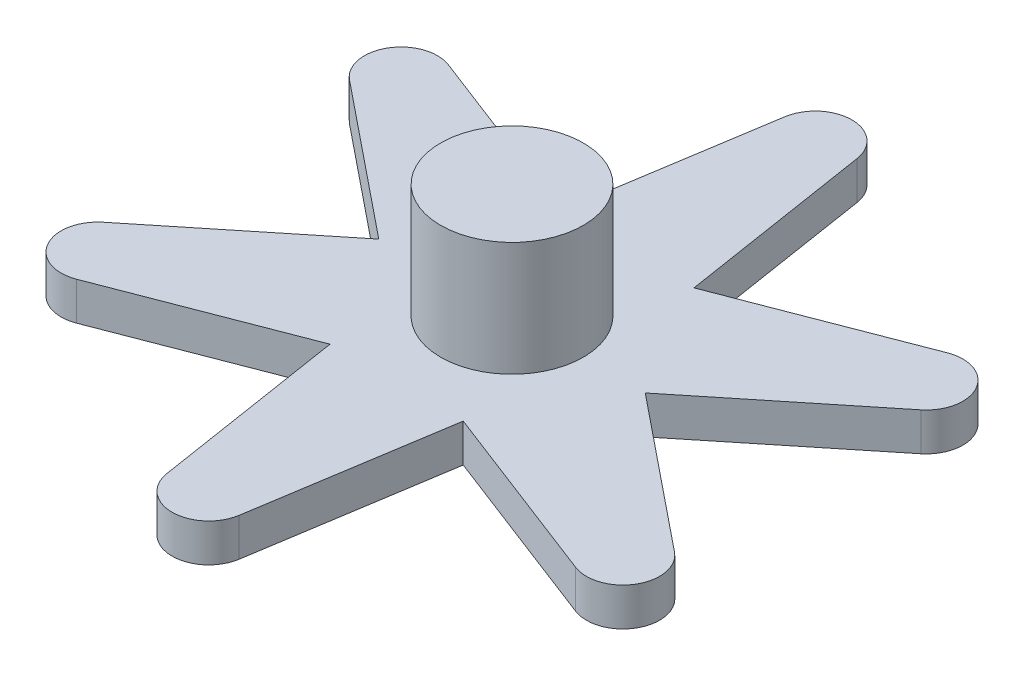
ISO-10303-21;
HEADER;
FILE_DESCRIPTION(('STEP AP214'),'2;1');
FILE_NAME('part.step','',(''),(''),'','','');
FILE_SCHEMA(('AUTOMOTIVE_DESIGN { 1 0 10303 214 1 1 1 1 }'));
ENDSEC;
DATA;
#1=APPLICATION_CONTEXT('core data for automotive mechanical design processes');
#2=APPLICATION_PROTOCOL_DEFINITION('international standard','automotive_design',2000,#1);
#3=PRODUCT_CONTEXT('',#1,'mechanical');
#4=PRODUCT('Part','Part','',(#3));
#5=PRODUCT_RELATED_PRODUCT_CATEGORY('part','',(#4));
#6=PRODUCT_DEFINITION_FORMATION('','',#4);
#7=PRODUCT_DEFINITION_CONTEXT('part definition',#1,'design');
#8=PRODUCT_DEFINITION('design','',#6,#7);
#9=PRODUCT_DEFINITION_SHAPE('','',#8);
#10=(LENGTH_UNIT() NAMED_UNIT(*) SI_UNIT(.MILLI.,.METRE.));
#11=(NAMED_UNIT(*) PLANE_ANGLE_UNIT() SI_UNIT($,.RADIAN.));
#12=(NAMED_UNIT(*) SI_UNIT($,.STERADIAN.) SOLID_ANGLE_UNIT());
#13=UNCERTAINTY_MEASURE_WITH_UNIT(LENGTH_MEASURE(1.E-05),#10,'distance_accuracy_value','');
#14=(GEOMETRIC_REPRESENTATION_CONTEXT(3) GLOBAL_UNCERTAINTY_ASSIGNED_CONTEXT((#13)) GLOBAL_UNIT_ASSIGNED_CONTEXT((#10,
#11,#12)) REPRESENTATION_CONTEXT('',''));
#15=CARTESIAN_POINT('',(0.,0.,0.));
#16=DIRECTION('',(0.,0.,1.));
#17=DIRECTION('',(1.,0.,0.));
#18=AXIS2_PLACEMENT_3D('',#15,#16,#17);
#19=CARTESIAN_POINT('',(0.,2.,0.));
#20=DIRECTION('',(0.,1.,0.));
#21=DIRECTION('',(0.,0.,1.));
#22=AXIS2_PLACEMENT_3D('',#19,#20,#21);
#23=PLANE('',#22);
#24=DIRECTION('',(-0.155411112427727,0.,0.987849880363396));
#25=VECTOR('',#24,1.);
#26=CARTESIAN_POINT('',(-3.5,2.,-6.06217782649107));
#27=LINE('',#26,#25);
#28=CARTESIAN_POINT('',(-1.9,2.,-16.232363110484));
#29=VERTEX_POINT('',#28);
#30=CARTESIAN_POINT('',(-3.5,2.,-6.06217782649107));
#31=VERTEX_POINT('',#30);
#32=EDGE_CURVE('E281',#29,#31,#27,.T.);
#33=ORIENTED_EDGE('',*,*,#32,.T.);
#34=DIRECTION('',(-0.933208647733979,0.,-0.359334968788898));
#35=VECTOR('',#34,1.);
#36=CARTESIAN_POINT('',(-13.1076388171324,2.,-9.76162982243258));
#37=LINE('',#36,#35);
#38=CARTESIAN_POINT('',(-13.1076388171324,2.,-9.76162982243258));
#39=VERTEX_POINT('',#38);
#40=EDGE_CURVE('E164',#31,#39,#37,.T.);
#41=ORIENTED_EDGE('',*,*,#40,.T.);
#42=CARTESIAN_POINT('',(-13.7987726161746,2.,-7.96672508443505));
#43=DIRECTION('',(0.,1.,0.));
#44=DIRECTION('',(-0.866025403784433,0.,-0.50000000000001));
#45=AXIS2_PLACEMENT_3D('',#42,#43,#44);
#46=CIRCLE('',#45,1.92336916546576);
#47=CARTESIAN_POINT('',(-15.0076388171324,2.,-6.47073328805174));
#48=VERTEX_POINT('',#47);
#49=EDGE_CURVE('E175',#39,#48,#46,.T.);
#50=ORIENTED_EDGE('',*,*,#49,.T.);
#51=DIRECTION('',(0.777797535306249,0.,0.628514911574518));
#52=VECTOR('',#51,1.);
#53=CARTESIAN_POINT('',(-7.,2.,0.));
#54=LINE('',#53,#52);
#55=CARTESIAN_POINT('',(-7.,2.,0.));
#56=VERTEX_POINT('',#55);
#57=EDGE_CURVE('E179',#48,#56,#54,.T.);
#58=ORIENTED_EDGE('',*,*,#57,.T.);
#59=DIRECTION('',(-0.777797535306262,0.,0.628514911574502));
#60=VECTOR('',#59,1.);
#61=CARTESIAN_POINT('',(-15.0076388171326,2.,6.47073328805142));
#62=LINE('',#61,#60);
#63=CARTESIAN_POINT('',(-15.0076388171326,2.,6.47073328805142));
#64=VERTEX_POINT('',#63);
#65=EDGE_CURVE('E199',#56,#64,#62,.T.);
#66=ORIENTED_EDGE('',*,*,#65,.T.);
#67=CARTESIAN_POINT('',(-13.7987726161747,2.,7.96672508443476));
#68=DIRECTION('',(0.,1.,0.));
#69=DIRECTION('',(-0.866025403784443,0.,0.499999999999992));
#70=AXIS2_PLACEMENT_3D('',#67,#68,#69);
#71=CIRCLE('',#70,1.92336916546576);
#72=CARTESIAN_POINT('',(-13.1076388171326,2.,9.7616298224323));
#73=VERTEX_POINT('',#72);
#74=EDGE_CURVE('E197',#64,#73,#71,.T.);
#75=ORIENTED_EDGE('',*,*,#74,.T.);
#76=DIRECTION('',(0.933208647733986,0.,-0.359334968788879));
#77=VECTOR('',#76,1.);
#78=CARTESIAN_POINT('',(-3.50000000000006,2.,6.06217782649104));
#79=LINE('',#78,#77);
#80=CARTESIAN_POINT('',(-3.50000000000006,2.,6.06217782649104));
#81=VERTEX_POINT('',#80);
#82=EDGE_CURVE('E203',#73,#81,#79,.T.);
#83=ORIENTED_EDGE('',*,*,#82,.T.);
#84=DIRECTION('',(0.155411112427727,0.,0.987849880363396));
#85=VECTOR('',#84,1.);
#86=CARTESIAN_POINT('',(-1.9,2.,16.232363110484));
#87=LINE('',#86,#85);
#88=CARTESIAN_POINT('',(-1.9,2.,16.232363110484));
#89=VERTEX_POINT('',#88);
#90=EDGE_CURVE('E220',#81,#89,#87,.T.);
#91=ORIENTED_EDGE('',*,*,#90,.T.);
#92=CARTESIAN_POINT('',(0.,2.,15.9334501688698));
#93=DIRECTION('',(0.,1.,0.));
#94=DIRECTION('',(0.,0.,1.));
#95=AXIS2_PLACEMENT_3D('',#92,#93,#94);
#96=CIRCLE('',#95,1.92336916546576);
#97=CARTESIAN_POINT('',(1.9,2.,16.232363110484));
#98=VERTEX_POINT('',#97);
#99=EDGE_CURVE('E218',#89,#98,#96,.T.);
#100=ORIENTED_EDGE('',*,*,#99,.T.);
#101=DIRECTION('',(0.155411112427727,0.,-0.987849880363396));
#102=VECTOR('',#101,1.);
#103=CARTESIAN_POINT('',(3.5,2.,6.06217782649107));
#104=LINE('',#103,#102);
#105=CARTESIAN_POINT('',(3.5,2.,6.06217782649107));
#106=VERTEX_POINT('',#105);
#107=EDGE_CURVE('E224',#98,#106,#104,.T.);
#108=ORIENTED_EDGE('',*,*,#107,.T.);
#109=DIRECTION('',(0.933208647733982,0.,0.359334968788892));
#110=VECTOR('',#109,1.);
#111=CARTESIAN_POINT('',(13.1076388171325,2.,9.76162982243249));
#112=LINE('',#111,#110);
#113=CARTESIAN_POINT('',(13.1076388171325,2.,9.76162982243249));
#114=VERTEX_POINT('',#113);
#115=EDGE_CURVE('E242',#106,#114,#112,.T.);
#116=ORIENTED_EDGE('',*,*,#115,.T.);
#117=CARTESIAN_POINT('',(13.7987726161746,2.,7.96672508443495));
#118=DIRECTION('',(0.,1.,0.));
#119=DIRECTION('',(0.866025403784436,0.,0.500000000000004));
#120=AXIS2_PLACEMENT_3D('',#117,#118,#119);
#121=CIRCLE('',#120,1.92336916546576);
#122=CARTESIAN_POINT('',(15.0076388171325,2.,6.47073328805163));
#123=VERTEX_POINT('',#122);
#124=EDGE_CURVE('E240',#114,#123,#121,.T.);
#125=ORIENTED_EDGE('',*,*,#124,.T.);
#126=DIRECTION('',(-0.777797535306254,0.,-0.628514911574513));
#127=VECTOR('',#126,1.);
#128=CARTESIAN_POINT('',(7.,2.,0.));
#129=LINE('',#128,#127);
#130=CARTESIAN_POINT('',(7.,2.,0.));
#131=VERTEX_POINT('',#130);
#132=EDGE_CURVE('E246',#123,#131,#129,.T.);
#133=ORIENTED_EDGE('',*,*,#132,.T.);
#134=DIRECTION('',(0.777797535306258,0.,-0.628514911574507));
#135=VECTOR('',#134,1.);
#136=CARTESIAN_POINT('',(15.0076388171325,2.,-6.47073328805152));
#137=LINE('',#136,#135);
#138=CARTESIAN_POINT('',(15.0076388171325,2.,-6.47073328805152));
#139=VERTEX_POINT('',#138);
#140=EDGE_CURVE('E264',#131,#139,#137,.T.);
#141=ORIENTED_EDGE('',*,*,#140,.T.);
#142=CARTESIAN_POINT('',(13.7987726161747,2.,-7.96672508443485));
#143=DIRECTION('',(0.,1.,0.));
#144=DIRECTION('',(0.86602540378444,0.,-0.499999999999998));
#145=AXIS2_PLACEMENT_3D('',#142,#143,#144);
#146=CIRCLE('',#145,1.92336916546576);
#147=CARTESIAN_POINT('',(13.1076388171325,2.,-9.7616298224324));
#148=VERTEX_POINT('',#147);
#149=EDGE_CURVE('E233',#139,#148,#146,.T.);
#150=ORIENTED_EDGE('',*,*,#149,.T.);
#151=DIRECTION('',(-0.933208647733984,0.,0.359334968788885));
#152=VECTOR('',#151,1.);
#153=CARTESIAN_POINT('',(3.50000000000001,2.,-6.06217782649106));
#154=LINE('',#153,#152);
#155=CARTESIAN_POINT('',(3.50000000000001,2.,-6.06217782649106));
#156=VERTEX_POINT('',#155);
#157=EDGE_CURVE('E261',#148,#156,#154,.T.);
#158=ORIENTED_EDGE('',*,*,#157,.T.);
#159=DIRECTION('',(-0.155411112427727,0.,-0.987849880363396));
#160=VECTOR('',#159,1.);
#161=CARTESIAN_POINT('',(1.9,2.,-16.232363110484));
#162=LINE('',#161,#160);
#163=CARTESIAN_POINT('',(1.9,2.,-16.232363110484));
#164=VERTEX_POINT('',#163);
#165=EDGE_CURVE('E284',#156,#164,#162,.T.);
#166=ORIENTED_EDGE('',*,*,#165,.T.);
#167=CARTESIAN_POINT('',(0.,2.,-15.9334501688698));
#168=DIRECTION('',(0.,1.,0.));
#169=DIRECTION('',(0.,0.,-1.));
#170=AXIS2_PLACEMENT_3D('',#167,#168,#169);
#171=CIRCLE('',#170,1.92336916546576);
#172=EDGE_CURVE('E274',#164,#29,#171,.T.);
#173=ORIENTED_EDGE('',*,*,#172,.T.);
#174=EDGE_LOOP('',(#33,#41,#50,#58,#66,#75,#83,#91,#100,#108,#116,#125,#133,#141,#150,#158,#166,#173));
#175=FACE_BOUND('',#174,.T.);
#176=CARTESIAN_POINT('',(0.,2.,0.));
#177=DIRECTION('',(0.,1.,0.));
#178=DIRECTION('',(0.,0.,1.));
#179=AXIS2_PLACEMENT_3D('',#176,#177,#178);
#180=CIRCLE('',#179,3.75);
#181=CARTESIAN_POINT('',(0.,2.,3.75));
#182=VERTEX_POINT('',#181);
#183=EDGE_CURVE('E363',#182,#182,#180,.T.);
#184=ORIENTED_EDGE('',*,*,#183,.F.);
#185=EDGE_LOOP('',(#184));
#186=FACE_BOUND('',#185,.T.);
#187=ADVANCED_FACE('F33',(#175,#186),#23,.T.);
#188=CARTESIAN_POINT('',(0.,0.,0.));
#189=DIRECTION('',(0.,1.,0.));
#190=DIRECTION('',(0.,0.,1.));
#191=AXIS2_PLACEMENT_3D('',#188,#189,#190);
#192=PLANE('',#191);
#193=DIRECTION('',(0.777797535306262,0.,-0.628514911574502));
#194=VECTOR('',#193,1.);
#195=CARTESIAN_POINT('',(-15.0076388171326,0.,6.47073328805142));
#196=LINE('',#195,#194);
#197=CARTESIAN_POINT('',(-15.0076388171326,0.,6.47073328805142));
#198=VERTEX_POINT('',#197);
#199=CARTESIAN_POINT('',(-7.,0.,0.));
#200=VERTEX_POINT('',#199);
#201=EDGE_CURVE('E48',#198,#200,#196,.T.);
#202=ORIENTED_EDGE('',*,*,#201,.T.);
#203=DIRECTION('',(-0.777797535306249,0.,-0.628514911574518));
#204=VECTOR('',#203,1.);
#205=CARTESIAN_POINT('',(-7.,0.,0.));
#206=LINE('',#205,#204);
#207=CARTESIAN_POINT('',(-15.0076388171324,0.,-6.47073328805173));
#208=VERTEX_POINT('',#207);
#209=EDGE_CURVE('E160',#200,#208,#206,.T.);
#210=ORIENTED_EDGE('',*,*,#209,.T.);
#211=CARTESIAN_POINT('',(-13.7987726161746,0.,-7.96672508443505));
#212=DIRECTION('',(0.,1.,0.));
#213=DIRECTION('',(0.,0.,1.));
#214=AXIS2_PLACEMENT_3D('',#211,#212,#213);
#215=CIRCLE('',#214,1.92336916546576);
#216=CARTESIAN_POINT('',(-13.1076388171324,0.,-9.76162982243258));
#217=VERTEX_POINT('',#216);
#218=EDGE_CURVE('E155',#208,#217,#215,.F.);
#219=ORIENTED_EDGE('',*,*,#218,.T.);
#220=DIRECTION('',(0.933208647733979,0.,0.359334968788898));
#221=VECTOR('',#220,1.);
#222=CARTESIAN_POINT('',(-13.1076388171324,0.,-9.76162982243258));
#223=LINE('',#222,#221);
#224=CARTESIAN_POINT('',(-3.5,0.,-6.06217782649107));
#225=VERTEX_POINT('',#224);
#226=EDGE_CURVE('E157',#217,#225,#223,.T.);
#227=ORIENTED_EDGE('',*,*,#226,.T.);
#228=DIRECTION('',(0.155411112427727,0.,-0.987849880363396));
#229=VECTOR('',#228,1.);
#230=CARTESIAN_POINT('',(-3.5,0.,-6.06217782649107));
#231=LINE('',#230,#229);
#232=CARTESIAN_POINT('',(-1.9,0.,-16.232363110484));
#233=VERTEX_POINT('',#232);
#234=EDGE_CURVE('E11',#225,#233,#231,.T.);
#235=ORIENTED_EDGE('',*,*,#234,.T.);
#236=CARTESIAN_POINT('',(0.,0.,-15.9334501688698));
#237=DIRECTION('',(0.,1.,0.));
#238=DIRECTION('',(0.,0.,1.));
#239=AXIS2_PLACEMENT_3D('',#236,#237,#238);
#240=CIRCLE('',#239,1.92336916546576);
#241=CARTESIAN_POINT('',(1.9,0.,-16.232363110484));
#242=VERTEX_POINT('',#241);
#243=EDGE_CURVE('E41',#233,#242,#240,.F.);
#244=ORIENTED_EDGE('',*,*,#243,.T.);
#245=DIRECTION('',(0.155411112427727,0.,0.987849880363396));
#246=VECTOR('',#245,1.);
#247=CARTESIAN_POINT('',(1.9,0.,-16.232363110484));
#248=LINE('',#247,#246);
#249=CARTESIAN_POINT('',(3.5,0.,-6.06217782649107));
#250=VERTEX_POINT('',#249);
#251=EDGE_CURVE('E275',#242,#250,#248,.T.);
#252=ORIENTED_EDGE('',*,*,#251,.T.);
#253=DIRECTION('',(0.933208647733984,0.,-0.359334968788885));
#254=VECTOR('',#253,1.);
#255=CARTESIAN_POINT('',(3.50000000000001,0.,-6.06217782649106));
#256=LINE('',#255,#254);
#257=CARTESIAN_POINT('',(13.1076388171325,0.,-9.7616298224324));
#258=VERTEX_POINT('',#257);
#259=EDGE_CURVE('E258',#250,#258,#256,.T.);
#260=ORIENTED_EDGE('',*,*,#259,.T.);
#261=CARTESIAN_POINT('',(13.7987726161747,0.,-7.96672508443485));
#262=DIRECTION('',(0.,1.,0.));
#263=DIRECTION('',(0.,0.,1.));
#264=AXIS2_PLACEMENT_3D('',#261,#262,#263);
#265=CIRCLE('',#264,1.92336916546576);
#266=CARTESIAN_POINT('',(15.0076388171325,0.,-6.47073328805152));
#267=VERTEX_POINT('',#266);
#268=EDGE_CURVE('E255',#258,#267,#265,.F.);
#269=ORIENTED_EDGE('',*,*,#268,.T.);
#270=DIRECTION('',(-0.777797535306258,0.,0.628514911574507));
#271=VECTOR('',#270,1.);
#272=CARTESIAN_POINT('',(15.0076388171325,0.,-6.47073328805152));
#273=LINE('',#272,#271);
#274=CARTESIAN_POINT('',(7.,0.,0.));
#275=VERTEX_POINT('',#274);
#276=EDGE_CURVE('E253',#267,#275,#273,.T.);
#277=ORIENTED_EDGE('',*,*,#276,.T.);
#278=DIRECTION('',(0.777797535306254,0.,0.628514911574513));
#279=VECTOR('',#278,1.);
#280=CARTESIAN_POINT('',(7.,0.,0.));
#281=LINE('',#280,#279);
#282=CARTESIAN_POINT('',(15.0076388171325,0.,6.47073328805163));
#283=VERTEX_POINT('',#282);
#284=EDGE_CURVE('E231',#275,#283,#281,.T.);
#285=ORIENTED_EDGE('',*,*,#284,.T.);
#286=CARTESIAN_POINT('',(13.7987726161746,0.,7.96672508443495));
#287=DIRECTION('',(0.,1.,0.));
#288=DIRECTION('',(0.,0.,1.));
#289=AXIS2_PLACEMENT_3D('',#286,#287,#288);
#290=CIRCLE('',#289,1.92336916546576);
#291=CARTESIAN_POINT('',(13.1076388171325,0.,9.76162982243249));
#292=VERTEX_POINT('',#291);
#293=EDGE_CURVE('E245',#283,#292,#290,.F.);
#294=ORIENTED_EDGE('',*,*,#293,.T.);
#295=DIRECTION('',(-0.933208647733982,0.,-0.359334968788892));
#296=VECTOR('',#295,1.);
#297=CARTESIAN_POINT('',(13.1076388171325,0.,9.76162982243249));
#298=LINE('',#297,#296);
#299=CARTESIAN_POINT('',(3.49999999999997,0.,6.06217782649109));
#300=VERTEX_POINT('',#299);
#301=EDGE_CURVE('E234',#292,#300,#298,.T.);
#302=ORIENTED_EDGE('',*,*,#301,.T.);
#303=DIRECTION('',(-0.155411112427727,0.,0.987849880363396));
#304=VECTOR('',#303,1.);
#305=CARTESIAN_POINT('',(3.5,0.,6.06217782649107));
#306=LINE('',#305,#304);
#307=CARTESIAN_POINT('',(1.9,0.,16.232363110484));
#308=VERTEX_POINT('',#307);
#309=EDGE_CURVE('E210',#300,#308,#306,.T.);
#310=ORIENTED_EDGE('',*,*,#309,.T.);
#311=CARTESIAN_POINT('',(0.,0.,15.9334501688698));
#312=DIRECTION('',(0.,1.,0.));
#313=DIRECTION('',(0.,0.,1.));
#314=AXIS2_PLACEMENT_3D('',#311,#312,#313);
#315=CIRCLE('',#314,1.92336916546576);
#316=CARTESIAN_POINT('',(-1.9,0.,16.232363110484));
#317=VERTEX_POINT('',#316);
#318=EDGE_CURVE('E223',#308,#317,#315,.F.);
#319=ORIENTED_EDGE('',*,*,#318,.T.);
#320=DIRECTION('',(-0.155411112427727,0.,-0.987849880363396));
#321=VECTOR('',#320,1.);
#322=CARTESIAN_POINT('',(-1.9,0.,16.232363110484));
#323=LINE('',#322,#321);
#324=CARTESIAN_POINT('',(-3.5,0.,6.06217782649107));
#325=VERTEX_POINT('',#324);
#326=EDGE_CURVE('E55',#317,#325,#323,.T.);
#327=ORIENTED_EDGE('',*,*,#326,.T.);
#328=DIRECTION('',(-0.933208647733986,0.,0.359334968788879));
#329=VECTOR('',#328,1.);
#330=CARTESIAN_POINT('',(-3.50000000000006,0.,6.06217782649104));
#331=LINE('',#330,#329);
#332=CARTESIAN_POINT('',(-13.1076388171326,0.,9.7616298224323));
#333=VERTEX_POINT('',#332);
#334=EDGE_CURVE('E188',#325,#333,#331,.T.);
#335=ORIENTED_EDGE('',*,*,#334,.T.);
#336=CARTESIAN_POINT('',(-13.7987726161747,0.,7.96672508443476));
#337=DIRECTION('',(0.,1.,0.));
#338=DIRECTION('',(0.,0.,1.));
#339=AXIS2_PLACEMENT_3D('',#336,#337,#338);
#340=CIRCLE('',#339,1.92336916546576);
#341=EDGE_CURVE('E202',#333,#198,#340,.F.);
#342=ORIENTED_EDGE('',*,*,#341,.T.);
#343=EDGE_LOOP('',(#202,#210,#219,#227,#235,#244,#252,#260,#269,#277,#285,#294,#302,#310,#319,
#327,#335,#342));
#344=FACE_BOUND('',#343,.T.);
#345=ADVANCED_FACE('F35',(#344),#192,.F.);
#346=CARTESIAN_POINT('',(0.,-13.7154499852745,-15.9334501688698));
#347=DIRECTION('',(0.,1.,0.));
#348=DIRECTION('',(0.,0.,1.));
#349=AXIS2_PLACEMENT_3D('',#346,#347,#348);
#350=CYLINDRICAL_SURFACE('',#349,1.92336916546576);
#351=ORIENTED_EDGE('',*,*,#243,.F.);
#352=DIRECTION('',(0.,1.,0.));
#353=VECTOR('',#352,1.);
#354=CARTESIAN_POINT('',(-1.9,-13.7154499852745,-16.232363110484));
#355=LINE('',#354,#353);
#356=EDGE_CURVE('E287',#233,#29,#355,.T.);
#357=ORIENTED_EDGE('',*,*,#356,.T.);
#358=ORIENTED_EDGE('',*,*,#172,.F.);
#359=DIRECTION('',(0.,1.,0.));
#360=VECTOR('',#359,1.);
#361=CARTESIAN_POINT('',(1.9,-13.7154499852745,-16.232363110484));
#362=LINE('',#361,#360);
#363=EDGE_CURVE('E277',#242,#164,#362,.T.);
#364=ORIENTED_EDGE('',*,*,#363,.F.);
#365=EDGE_LOOP('',(#351,#357,#358,#364));
#366=FACE_BOUND('',#365,.T.);
#367=ADVANCED_FACE('F297',(#366),#350,.T.);
#368=CARTESIAN_POINT('',(1.9,-13.7154499852745,-16.232363110484));
#369=DIRECTION('',(0.987849880363396,0.,-0.155411112427727));
#370=DIRECTION('',(-0.155411112427727,0.,-0.987849880363396));
#371=AXIS2_PLACEMENT_3D('',#368,#369,#370);
#372=PLANE('',#371);
#373=ORIENTED_EDGE('',*,*,#251,.F.);
#374=ORIENTED_EDGE('',*,*,#363,.T.);
#375=ORIENTED_EDGE('',*,*,#165,.F.);
#376=DIRECTION('',(0.,1.,0.));
#377=VECTOR('',#376,1.);
#378=CARTESIAN_POINT('',(3.5,-13.7154499852745,-6.06217782649107));
#379=LINE('',#378,#377);
#380=EDGE_CURVE('E289',#250,#156,#379,.T.);
#381=ORIENTED_EDGE('',*,*,#380,.F.);
#382=EDGE_LOOP('',(#373,#374,#375,#381));
#383=FACE_BOUND('',#382,.T.);
#384=ADVANCED_FACE('F307',(#383),#372,.T.);
#385=CARTESIAN_POINT('',(-3.5,-13.7154499852745,-6.06217782649107));
#386=DIRECTION('',(-0.987849880363396,0.,-0.155411112427727));
#387=DIRECTION('',(-0.155411112427727,0.,0.987849880363396));
#388=AXIS2_PLACEMENT_3D('',#385,#386,#387);
#389=PLANE('',#388);
#390=ORIENTED_EDGE('',*,*,#234,.F.);
#391=DIRECTION('',(0.,1.,0.));
#392=VECTOR('',#391,1.);
#393=CARTESIAN_POINT('',(-3.5,-13.7154499852745,-6.06217782649107));
#394=LINE('',#393,#392);
#395=EDGE_CURVE('E171',#225,#31,#394,.T.);
#396=ORIENTED_EDGE('',*,*,#395,.T.);
#397=ORIENTED_EDGE('',*,*,#32,.F.);
#398=ORIENTED_EDGE('',*,*,#356,.F.);
#399=EDGE_LOOP('',(#390,#396,#397,#398));
#400=FACE_BOUND('',#399,.T.);
#401=ADVANCED_FACE('F300',(#400),#389,.T.);
#402=CARTESIAN_POINT('',(13.7987726161747,-15.7224271027866,-7.96672508443485));
#403=DIRECTION('',(0.,1.,0.));
#404=DIRECTION('',(0.,0.,1.));
#405=AXIS2_PLACEMENT_3D('',#402,#403,#404);
#406=CYLINDRICAL_SURFACE('',#405,1.92336916546576);
#407=ORIENTED_EDGE('',*,*,#268,.F.);
#408=DIRECTION('',(0.,1.,0.));
#409=VECTOR('',#408,1.);
#410=CARTESIAN_POINT('',(13.1076388171325,-15.7224271027866,-9.7616298224324));
#411=LINE('',#410,#409);
#412=EDGE_CURVE('E267',#258,#148,#411,.T.);
#413=ORIENTED_EDGE('',*,*,#412,.T.);
#414=ORIENTED_EDGE('',*,*,#149,.F.);
#415=DIRECTION('',(0.,1.,0.));
#416=VECTOR('',#415,1.);
#417=CARTESIAN_POINT('',(15.0076388171325,-15.7224271027866,-6.47073328805152));
#418=LINE('',#417,#416);
#419=EDGE_CURVE('E256',#267,#139,#418,.T.);
#420=ORIENTED_EDGE('',*,*,#419,.F.);
#421=EDGE_LOOP('',(#407,#413,#414,#420));
#422=FACE_BOUND('',#421,.T.);
#423=ADVANCED_FACE('F316',(#422),#406,.T.);
#424=CARTESIAN_POINT('',(15.0076388171325,-15.7224271027866,-6.47073328805152));
#425=DIRECTION('',(0.628514911574507,0.,0.777797535306258));
#426=DIRECTION('',(0.777797535306258,0.,-0.628514911574507));
#427=AXIS2_PLACEMENT_3D('',#424,#425,#426);
#428=PLANE('',#427);
#429=ORIENTED_EDGE('',*,*,#276,.F.);
#430=ORIENTED_EDGE('',*,*,#419,.T.);
#431=ORIENTED_EDGE('',*,*,#140,.F.);
#432=DIRECTION('',(0.,1.,0.));
#433=VECTOR('',#432,1.);
#434=CARTESIAN_POINT('',(7.,-15.7224271027866,0.));
#435=LINE('',#434,#433);
#436=EDGE_CURVE('E269',#275,#131,#435,.T.);
#437=ORIENTED_EDGE('',*,*,#436,.F.);
#438=EDGE_LOOP('',(#429,#430,#431,#437));
#439=FACE_BOUND('',#438,.T.);
#440=ADVANCED_FACE('F319',(#439),#428,.T.);
#441=CARTESIAN_POINT('',(3.50000000000001,-15.7224271027866,-6.06217782649106));
#442=DIRECTION('',(-0.359334968788885,0.,-0.933208647733984));
#443=DIRECTION('',(-0.933208647733984,0.,0.359334968788885));
#444=AXIS2_PLACEMENT_3D('',#441,#442,#443);
#445=PLANE('',#444);
#446=ORIENTED_EDGE('',*,*,#259,.F.);
#447=ORIENTED_EDGE('',*,*,#380,.T.);
#448=ORIENTED_EDGE('',*,*,#157,.F.);
#449=ORIENTED_EDGE('',*,*,#412,.F.);
#450=EDGE_LOOP('',(#446,#447,#448,#449));
#451=FACE_BOUND('',#450,.T.);
#452=ADVANCED_FACE('F310',(#451),#445,.T.);
#453=CARTESIAN_POINT('',(13.7987726161746,-15.7224271027866,7.96672508443495));
#454=DIRECTION('',(0.,1.,0.));
#455=DIRECTION('',(0.,0.,1.));
#456=AXIS2_PLACEMENT_3D('',#453,#454,#455);
#457=CYLINDRICAL_SURFACE('',#456,1.92336916546576);
#458=ORIENTED_EDGE('',*,*,#293,.F.);
#459=DIRECTION('',(0.,1.,0.));
#460=VECTOR('',#459,1.);
#461=CARTESIAN_POINT('',(15.0076388171325,-15.7224271027866,6.47073328805163));
#462=LINE('',#461,#460);
#463=EDGE_CURVE('E212',#283,#123,#462,.T.);
#464=ORIENTED_EDGE('',*,*,#463,.T.);
#465=ORIENTED_EDGE('',*,*,#124,.F.);
#466=DIRECTION('',(0.,1.,0.));
#467=VECTOR('',#466,1.);
#468=CARTESIAN_POINT('',(13.1076388171325,-15.7224271027866,9.76162982243249));
#469=LINE('',#468,#467);
#470=EDGE_CURVE('E236',#292,#114,#469,.T.);
#471=ORIENTED_EDGE('',*,*,#470,.F.);
#472=EDGE_LOOP('',(#458,#464,#465,#471));
#473=FACE_BOUND('',#472,.T.);
#474=ADVANCED_FACE('F328',(#473),#457,.T.);
#475=CARTESIAN_POINT('',(13.1076388171325,-15.7224271027866,9.76162982243249));
#476=DIRECTION('',(-0.359334968788892,0.,0.933208647733981));
#477=DIRECTION('',(0.933208647733982,0.,0.359334968788892));
#478=AXIS2_PLACEMENT_3D('',#475,#476,#477);
#479=PLANE('',#478);
#480=ORIENTED_EDGE('',*,*,#301,.F.);
#481=ORIENTED_EDGE('',*,*,#470,.T.);
#482=ORIENTED_EDGE('',*,*,#115,.F.);
#483=DIRECTION('',(0.,1.,0.));
#484=VECTOR('',#483,1.);
#485=CARTESIAN_POINT('',(3.49999999999997,-15.7224271027866,6.06217782649109));
#486=LINE('',#485,#484);
#487=EDGE_CURVE('E237',#300,#106,#486,.T.);
#488=ORIENTED_EDGE('',*,*,#487,.F.);
#489=EDGE_LOOP('',(#480,#481,#482,#488));
#490=FACE_BOUND('',#489,.T.);
#491=ADVANCED_FACE('F335',(#490),#479,.T.);
#492=CARTESIAN_POINT('',(7.,-15.7224271027866,0.));
#493=DIRECTION('',(0.628514911574513,0.,-0.777797535306254));
#494=DIRECTION('',(-0.777797535306254,0.,-0.628514911574513));
#495=AXIS2_PLACEMENT_3D('',#492,#493,#494);
#496=PLANE('',#495);
#497=ORIENTED_EDGE('',*,*,#284,.F.);
#498=ORIENTED_EDGE('',*,*,#436,.T.);
#499=ORIENTED_EDGE('',*,*,#132,.F.);
#500=ORIENTED_EDGE('',*,*,#463,.F.);
#501=EDGE_LOOP('',(#497,#498,#499,#500));
#502=FACE_BOUND('',#501,.T.);
#503=ADVANCED_FACE('F331',(#502),#496,.T.);
#504=CARTESIAN_POINT('',(0.,-13.7154499852745,15.9334501688698));
#505=DIRECTION('',(0.,1.,0.));
#506=DIRECTION('',(0.,0.,1.));
#507=AXIS2_PLACEMENT_3D('',#504,#505,#506);
#508=CYLINDRICAL_SURFACE('',#507,1.92336916546576);
#509=ORIENTED_EDGE('',*,*,#318,.F.);
#510=DIRECTION('',(0.,1.,0.));
#511=VECTOR('',#510,1.);
#512=CARTESIAN_POINT('',(1.9,-13.7154499852745,16.232363110484));
#513=LINE('',#512,#511);
#514=EDGE_CURVE('E190',#308,#98,#513,.T.);
#515=ORIENTED_EDGE('',*,*,#514,.T.);
#516=ORIENTED_EDGE('',*,*,#99,.F.);
#517=DIRECTION('',(0.,1.,0.));
#518=VECTOR('',#517,1.);
#519=CARTESIAN_POINT('',(-1.9,-13.7154499852745,16.232363110484));
#520=LINE('',#519,#518);
#521=EDGE_CURVE('E214',#317,#89,#520,.T.);
#522=ORIENTED_EDGE('',*,*,#521,.F.);
#523=EDGE_LOOP('',(#509,#515,#516,#522));
#524=FACE_BOUND('',#523,.T.);
#525=ADVANCED_FACE('F343',(#524),#508,.T.);
#526=CARTESIAN_POINT('',(-1.9,-13.7154499852745,16.232363110484));
#527=DIRECTION('',(-0.987849880363396,0.,0.155411112427727));
#528=DIRECTION('',(0.155411112427727,0.,0.987849880363396));
#529=AXIS2_PLACEMENT_3D('',#526,#527,#528);
#530=PLANE('',#529);
#531=ORIENTED_EDGE('',*,*,#326,.F.);
#532=ORIENTED_EDGE('',*,*,#521,.T.);
#533=ORIENTED_EDGE('',*,*,#90,.F.);
#534=DIRECTION('',(0.,1.,0.));
#535=VECTOR('',#534,1.);
#536=CARTESIAN_POINT('',(-3.5,-13.7154499852745,6.06217782649107));
#537=LINE('',#536,#535);
#538=EDGE_CURVE('E215',#325,#81,#537,.T.);
#539=ORIENTED_EDGE('',*,*,#538,.F.);
#540=EDGE_LOOP('',(#531,#532,#533,#539));
#541=FACE_BOUND('',#540,.T.);
#542=ADVANCED_FACE('F346',(#541),#530,.T.);
#543=CARTESIAN_POINT('',(3.5,-13.7154499852745,6.06217782649107));
#544=DIRECTION('',(0.987849880363396,0.,0.155411112427727));
#545=DIRECTION('',(0.155411112427727,0.,-0.987849880363396));
#546=AXIS2_PLACEMENT_3D('',#543,#544,#545);
#547=PLANE('',#546);
#548=ORIENTED_EDGE('',*,*,#309,.F.);
#549=ORIENTED_EDGE('',*,*,#487,.T.);
#550=ORIENTED_EDGE('',*,*,#107,.F.);
#551=ORIENTED_EDGE('',*,*,#514,.F.);
#552=EDGE_LOOP('',(#548,#549,#550,#551));
#553=FACE_BOUND('',#552,.T.);
#554=ADVANCED_FACE('F338',(#553),#547,.T.);
#555=CARTESIAN_POINT('',(-13.7987726161747,-15.7224271027866,7.96672508443476));
#556=DIRECTION('',(0.,1.,0.));
#557=DIRECTION('',(0.,0.,1.));
#558=AXIS2_PLACEMENT_3D('',#555,#556,#557);
#559=CYLINDRICAL_SURFACE('',#558,1.92336916546576);
#560=ORIENTED_EDGE('',*,*,#341,.F.);
#561=DIRECTION('',(0.,1.,0.));
#562=VECTOR('',#561,1.);
#563=CARTESIAN_POINT('',(-13.1076388171326,-15.7224271027866,9.7616298224323));
#564=LINE('',#563,#562);
#565=EDGE_CURVE('E191',#333,#73,#564,.T.);
#566=ORIENTED_EDGE('',*,*,#565,.T.);
#567=ORIENTED_EDGE('',*,*,#74,.F.);
#568=DIRECTION('',(0.,1.,0.));
#569=VECTOR('',#568,1.);
#570=CARTESIAN_POINT('',(-15.0076388171326,-15.7224271027866,6.47073328805142));
#571=LINE('',#570,#569);
#572=EDGE_CURVE('E193',#198,#64,#571,.T.);
#573=ORIENTED_EDGE('',*,*,#572,.F.);
#574=EDGE_LOOP('',(#560,#566,#567,#573));
#575=FACE_BOUND('',#574,.T.);
#576=ADVANCED_FACE('F355',(#575),#559,.T.);
#577=CARTESIAN_POINT('',(-15.0076388171326,-15.7224271027866,6.47073328805142));
#578=DIRECTION('',(-0.628514911574502,0.,-0.777797535306262));
#579=DIRECTION('',(-0.777797535306262,0.,0.628514911574502));
#580=AXIS2_PLACEMENT_3D('',#577,#578,#579);
#581=PLANE('',#580);
#582=ORIENTED_EDGE('',*,*,#201,.F.);
#583=ORIENTED_EDGE('',*,*,#572,.T.);
#584=ORIENTED_EDGE('',*,*,#65,.F.);
#585=DIRECTION('',(0.,1.,0.));
#586=VECTOR('',#585,1.);
#587=CARTESIAN_POINT('',(-7.,-15.7224271027866,0.));
#588=LINE('',#587,#586);
#589=EDGE_CURVE('E194',#200,#56,#588,.T.);
#590=ORIENTED_EDGE('',*,*,#589,.F.);
#591=EDGE_LOOP('',(#582,#583,#584,#590));
#592=FACE_BOUND('',#591,.T.);
#593=ADVANCED_FACE('F358',(#592),#581,.T.);
#594=CARTESIAN_POINT('',(-3.50000000000006,-15.7224271027866,6.06217782649104));
#595=DIRECTION('',(0.359334968788879,0.,0.933208647733986));
#596=DIRECTION('',(0.933208647733986,0.,-0.359334968788879));
#597=AXIS2_PLACEMENT_3D('',#594,#595,#596);
#598=PLANE('',#597);
#599=ORIENTED_EDGE('',*,*,#334,.F.);
#600=ORIENTED_EDGE('',*,*,#538,.T.);
#601=ORIENTED_EDGE('',*,*,#82,.F.);
#602=ORIENTED_EDGE('',*,*,#565,.F.);
#603=EDGE_LOOP('',(#599,#600,#601,#602));
#604=FACE_BOUND('',#603,.T.);
#605=ADVANCED_FACE('F351',(#604),#598,.T.);
#606=CARTESIAN_POINT('',(-13.7987726161746,-15.7224271027866,-7.96672508443505));
#607=DIRECTION('',(0.,1.,0.));
#608=DIRECTION('',(0.,0.,1.));
#609=AXIS2_PLACEMENT_3D('',#606,#607,#608);
#610=CYLINDRICAL_SURFACE('',#609,1.92336916546576);
#611=ORIENTED_EDGE('',*,*,#218,.F.);
#612=DIRECTION('',(0.,1.,0.));
#613=VECTOR('',#612,1.);
#614=CARTESIAN_POINT('',(-15.0076388171324,-15.7224271027866,-6.47073328805174));
#615=LINE('',#614,#613);
#616=EDGE_CURVE('E177',#208,#48,#615,.T.);
#617=ORIENTED_EDGE('',*,*,#616,.T.);
#618=ORIENTED_EDGE('',*,*,#49,.F.);
#619=DIRECTION('',(0.,1.,0.));
#620=VECTOR('',#619,1.);
#621=CARTESIAN_POINT('',(-13.1076388171324,-15.7224271027866,-9.76162982243258));
#622=LINE('',#621,#620);
#623=EDGE_CURVE('E169',#217,#39,#622,.T.);
#624=ORIENTED_EDGE('',*,*,#623,.F.);
#625=EDGE_LOOP('',(#611,#617,#618,#624));
#626=FACE_BOUND('',#625,.T.);
#627=ADVANCED_FACE('F173',(#626),#610,.T.);
#628=CARTESIAN_POINT('',(-13.1076388171324,-15.7224271027866,-9.76162982243258));
#629=DIRECTION('',(0.359334968788898,0.,-0.933208647733979));
#630=DIRECTION('',(-0.933208647733979,0.,-0.359334968788898));
#631=AXIS2_PLACEMENT_3D('',#628,#629,#630);
#632=PLANE('',#631);
#633=ORIENTED_EDGE('',*,*,#226,.F.);
#634=ORIENTED_EDGE('',*,*,#623,.T.);
#635=ORIENTED_EDGE('',*,*,#40,.F.);
#636=ORIENTED_EDGE('',*,*,#395,.F.);
#637=EDGE_LOOP('',(#633,#634,#635,#636));
#638=FACE_BOUND('',#637,.T.);
#639=ADVANCED_FACE('F167',(#638),#632,.T.);
#640=CARTESIAN_POINT('',(-7.,-15.7224271027866,0.));
#641=DIRECTION('',(-0.628514911574518,0.,0.777797535306249));
#642=DIRECTION('',(0.777797535306249,0.,0.628514911574518));
#643=AXIS2_PLACEMENT_3D('',#640,#641,#642);
#644=PLANE('',#643);
#645=ORIENTED_EDGE('',*,*,#209,.F.);
#646=ORIENTED_EDGE('',*,*,#589,.T.);
#647=ORIENTED_EDGE('',*,*,#57,.F.);
#648=ORIENTED_EDGE('',*,*,#616,.F.);
#649=EDGE_LOOP('',(#645,#646,#647,#648));
#650=FACE_BOUND('',#649,.T.);
#651=ADVANCED_FACE('F361',(#650),#644,.T.);
#652=CARTESIAN_POINT('',(0.,8.,0.));
#653=DIRECTION('',(0.,-1.,0.));
#654=DIRECTION('',(0.,0.,-1.));
#655=AXIS2_PLACEMENT_3D('',#652,#653,#654);
#656=CYLINDRICAL_SURFACE('',#655,3.75);
#657=CARTESIAN_POINT('',(0.,8.,0.));
#658=DIRECTION('',(0.,1.,0.));
#659=DIRECTION('',(0.,0.,1.));
#660=AXIS2_PLACEMENT_3D('',#657,#658,#659);
#661=CIRCLE('',#660,3.75);
#662=CARTESIAN_POINT('',(0.,8.,3.75));
#663=VERTEX_POINT('',#662);
#664=EDGE_CURVE('E181',#663,#663,#661,.T.);
#665=ORIENTED_EDGE('',*,*,#664,.F.);
#666=EDGE_LOOP('',(#665));
#667=FACE_BOUND('',#666,.T.);
#668=ORIENTED_EDGE('',*,*,#183,.T.);
#669=EDGE_LOOP('',(#668));
#670=FACE_BOUND('',#669,.T.);
#671=ADVANCED_FACE('F371',(#667,#670),#656,.T.);
#672=CARTESIAN_POINT('',(0.,8.,0.));
#673=DIRECTION('',(0.,1.,0.));
#674=DIRECTION('',(0.,0.,1.));
#675=AXIS2_PLACEMENT_3D('',#672,#673,#674);
#676=PLANE('',#675);
#677=ORIENTED_EDGE('',*,*,#664,.T.);
#678=EDGE_LOOP('',(#677));
#679=FACE_BOUND('',#678,.T.);
#680=ADVANCED_FACE('F369',(#679),#676,.T.);
#681=CLOSED_SHELL('',(#187,#345,#367,#384,#401,#423,#440,#452,#474,#491,#503,#525,#542,#554,
#576,#593,#605,#627,#639,#651,#671,#680));
#682=MANIFOLD_SOLID_BREP('B2',#681);
#683=ADVANCED_BREP_SHAPE_REPRESENTATION('',(#18,#682),#14);
#684=SHAPE_DEFINITION_REPRESENTATION(#9,#683);
ENDSEC;
END-ISO-10303-21;
